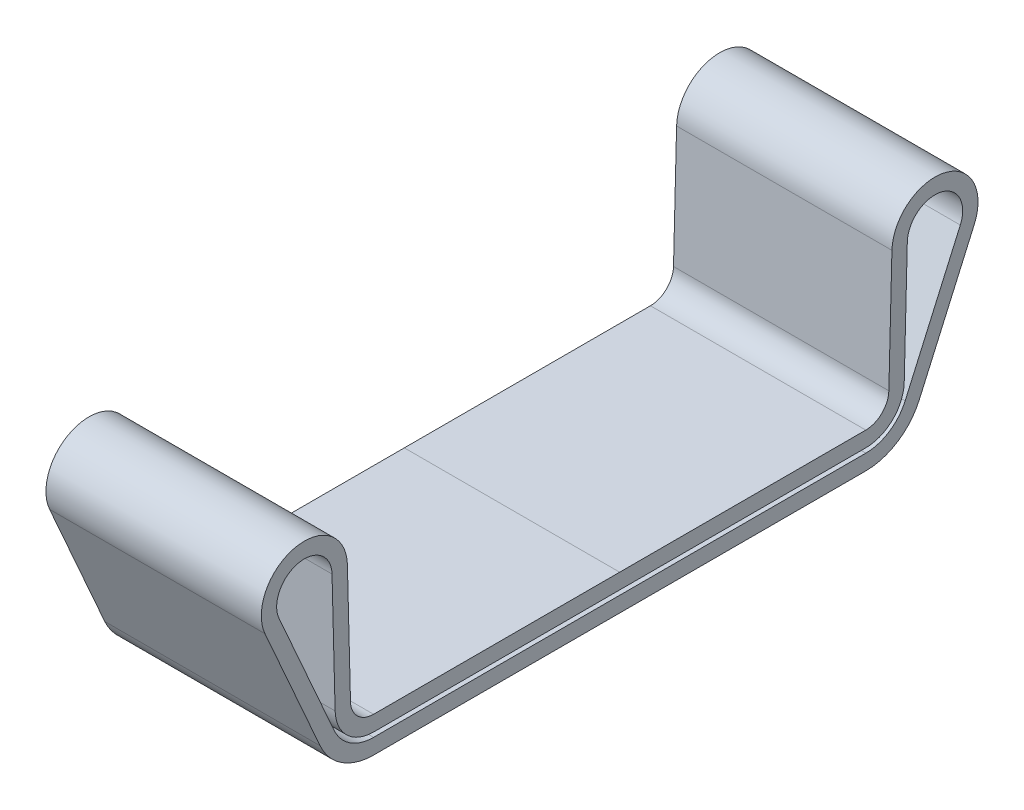
ISO-10303-21;
HEADER;
FILE_DESCRIPTION(('STEP AP214'),'2;1');
FILE_NAME('part.step','',(''),(''),'','','');
FILE_SCHEMA(('AUTOMOTIVE_DESIGN { 1 0 10303 214 1 1 1 1 }'));
ENDSEC;
DATA;
#1=APPLICATION_CONTEXT('core data for automotive mechanical design processes');
#2=APPLICATION_PROTOCOL_DEFINITION('international standard','automotive_design',2000,#1);
#3=PRODUCT_CONTEXT('',#1,'mechanical');
#4=PRODUCT('Part','Part','',(#3));
#5=PRODUCT_RELATED_PRODUCT_CATEGORY('part','',(#4));
#6=PRODUCT_DEFINITION_FORMATION('','',#4);
#7=PRODUCT_DEFINITION_CONTEXT('part definition',#1,'design');
#8=PRODUCT_DEFINITION('design','',#6,#7);
#9=PRODUCT_DEFINITION_SHAPE('','',#8);
#10=(LENGTH_UNIT() NAMED_UNIT(*) SI_UNIT(.MILLI.,.METRE.));
#11=(NAMED_UNIT(*) PLANE_ANGLE_UNIT() SI_UNIT($,.RADIAN.));
#12=(NAMED_UNIT(*) SI_UNIT($,.STERADIAN.) SOLID_ANGLE_UNIT());
#13=UNCERTAINTY_MEASURE_WITH_UNIT(LENGTH_MEASURE(1.E-05),#10,'distance_accuracy_value','');
#14=(GEOMETRIC_REPRESENTATION_CONTEXT(3) GLOBAL_UNCERTAINTY_ASSIGNED_CONTEXT((#13)) GLOBAL_UNIT_ASSIGNED_CONTEXT((#10,
#11,#12)) REPRESENTATION_CONTEXT('',''));
#15=CARTESIAN_POINT('',(0.,0.,0.));
#16=DIRECTION('',(0.,0.,1.));
#17=DIRECTION('',(1.,0.,0.));
#18=AXIS2_PLACEMENT_3D('',#15,#16,#17);
#19=CARTESIAN_POINT('',(7.,7.50000000000001,20.5));
#20=DIRECTION('',(-1.,0.,0.));
#21=DIRECTION('',(0.,0.,1.));
#22=AXIS2_PLACEMENT_3D('',#19,#20,#21);
#23=CYLINDRICAL_SURFACE('',#22,1.8);
#24=CARTESIAN_POINT('',(-7.,7.50000000000001,20.5));
#25=DIRECTION('',(-1.,0.,0.));
#26=DIRECTION('',(0.,0.,-1.));
#27=AXIS2_PLACEMENT_3D('',#24,#25,#26);
#28=CIRCLE('',#27,1.8);
#29=CARTESIAN_POINT('',(-7.,6.7718398936245,22.1461418102591));
#30=VERTEX_POINT('',#29);
#31=CARTESIAN_POINT('',(-7.,7.54628935623504,18.7005952941322));
#32=VERTEX_POINT('',#31);
#33=EDGE_CURVE('E189',#30,#32,#28,.T.);
#34=ORIENTED_EDGE('',*,*,#33,.T.);
#35=DIRECTION('',(-1.,0.,0.));
#36=VECTOR('',#35,1.);
#37=CARTESIAN_POINT('',(7.,7.54628935623504,18.7005952941322));
#38=LINE('',#37,#36);
#39=CARTESIAN_POINT('',(7.,7.54628935623504,18.7005952941322));
#40=VERTEX_POINT('',#39);
#41=EDGE_CURVE('E13',#40,#32,#38,.T.);
#42=ORIENTED_EDGE('',*,*,#41,.F.);
#43=CARTESIAN_POINT('',(7.,7.50000000000001,20.5));
#44=DIRECTION('',(-1.,0.,0.));
#45=DIRECTION('',(0.,0.,-1.));
#46=AXIS2_PLACEMENT_3D('',#43,#44,#45);
#47=CIRCLE('',#46,1.8);
#48=CARTESIAN_POINT('',(7.,6.7718398936245,22.1461418102591));
#49=VERTEX_POINT('',#48);
#50=EDGE_CURVE('E217',#49,#40,#47,.T.);
#51=ORIENTED_EDGE('',*,*,#50,.F.);
#52=DIRECTION('',(-1.,0.,0.));
#53=VECTOR('',#52,1.);
#54=CARTESIAN_POINT('',(7.,6.7718398936245,22.1461418102591));
#55=LINE('',#54,#53);
#56=EDGE_CURVE('E185',#49,#30,#55,.T.);
#57=ORIENTED_EDGE('',*,*,#56,.T.);
#58=EDGE_LOOP('',(#34,#42,#51,#57));
#59=FACE_BOUND('',#58,.T.);
#60=ADVANCED_FACE('F48',(#59),#23,.F.);
#61=CARTESIAN_POINT('',(7.,7.54628935623504,18.7005952941322));
#62=DIRECTION('',(0.,0.025716309019469,-0.999669281037692));
#63=DIRECTION('',(0.,0.999669281037692,0.025716309019469));
#64=AXIS2_PLACEMENT_3D('',#61,#62,#63);
#65=PLANE('',#64);
#66=DIRECTION('',(0.,-0.999669281037692,-0.0257163090194691));
#67=VECTOR('',#66,1.);
#68=CARTESIAN_POINT('',(-7.,7.54628935623504,18.7005952941322));
#69=LINE('',#68,#67);
#70=CARTESIAN_POINT('',(-7.,-0.26430130433916,18.4996692810377));
#71=VERTEX_POINT('',#70);
#72=EDGE_CURVE('E192',#32,#71,#69,.T.);
#73=ORIENTED_EDGE('',*,*,#72,.T.);
#74=DIRECTION('',(-1.,0.,0.));
#75=VECTOR('',#74,1.);
#76=CARTESIAN_POINT('',(7.,-0.26430130433916,18.4996692810377));
#77=LINE('',#76,#75);
#78=CARTESIAN_POINT('',(7.,-0.26430130433916,18.4996692810377));
#79=VERTEX_POINT('',#78);
#80=EDGE_CURVE('E56',#79,#71,#77,.T.);
#81=ORIENTED_EDGE('',*,*,#80,.F.);
#82=DIRECTION('',(0.,-0.999669281037692,-0.0257163090194691));
#83=VECTOR('',#82,1.);
#84=CARTESIAN_POINT('',(7.,7.54628935623504,18.7005952941322));
#85=LINE('',#84,#83);
#86=EDGE_CURVE('E123',#40,#79,#85,.T.);
#87=ORIENTED_EDGE('',*,*,#86,.F.);
#88=ORIENTED_EDGE('',*,*,#41,.T.);
#89=EDGE_LOOP('',(#73,#81,#87,#88));
#90=FACE_BOUND('',#89,.T.);
#91=ADVANCED_FACE('F500',(#90),#65,.F.);
#92=CARTESIAN_POINT('',(7.,-0.200010531790487,16.0004960784435));
#93=DIRECTION('',(-1.,0.,0.));
#94=DIRECTION('',(0.,0.,1.));
#95=AXIS2_PLACEMENT_3D('',#92,#93,#94);
#96=CYLINDRICAL_SURFACE('',#95,2.5);
#97=CARTESIAN_POINT('',(-7.,-0.200010531790487,16.0004960784435));
#98=DIRECTION('',(1.,0.,0.));
#99=DIRECTION('',(0.,0.,-1.));
#100=AXIS2_PLACEMENT_3D('',#97,#98,#99);
#101=CIRCLE('',#100,2.5);
#102=CARTESIAN_POINT('',(-7.,-2.70001053178995,16.0004944329022));
#103=VERTEX_POINT('',#102);
#104=EDGE_CURVE('E195',#71,#103,#101,.T.);
#105=ORIENTED_EDGE('',*,*,#104,.T.);
#106=DIRECTION('',(-1.,0.,0.));
#107=VECTOR('',#106,1.);
#108=CARTESIAN_POINT('',(7.,-2.70001053178995,16.0004944329022));
#109=LINE('',#108,#107);
#110=CARTESIAN_POINT('',(7.,-2.70001053178995,16.0004944329022));
#111=VERTEX_POINT('',#110);
#112=EDGE_CURVE('E246',#111,#103,#109,.T.);
#113=ORIENTED_EDGE('',*,*,#112,.F.);
#114=CARTESIAN_POINT('',(7.,-0.200010531790487,16.0004960784435));
#115=DIRECTION('',(1.,0.,0.));
#116=DIRECTION('',(0.,0.,-1.));
#117=AXIS2_PLACEMENT_3D('',#114,#115,#116);
#118=CIRCLE('',#117,2.5);
#119=EDGE_CURVE('E256',#79,#111,#118,.T.);
#120=ORIENTED_EDGE('',*,*,#119,.F.);
#121=ORIENTED_EDGE('',*,*,#80,.T.);
#122=EDGE_LOOP('',(#105,#113,#120,#121));
#123=FACE_BOUND('',#122,.T.);
#124=ADVANCED_FACE('F254',(#123),#96,.T.);
#125=CARTESIAN_POINT('',(7.,-2.70000000000084,0.));
#126=DIRECTION('',(0.,0.999999999999784,6.58216478839203E-07));
#127=DIRECTION('',(0.,-6.58216478839203E-07,0.999999999999784));
#128=AXIS2_PLACEMENT_3D('',#125,#126,#127);
#129=PLANE('',#128);
#130=DIRECTION('',(0.,6.58216478839203E-07,-0.999999999999783));
#131=VECTOR('',#130,1.);
#132=CARTESIAN_POINT('',(-7.,-2.70000000000084,0.));
#133=LINE('',#132,#131);
#134=CARTESIAN_POINT('',(-7.,-2.70000000000084,0.));
#135=VERTEX_POINT('',#134);
#136=EDGE_CURVE('E197',#103,#135,#133,.T.);
#137=ORIENTED_EDGE('',*,*,#136,.T.);
#138=DIRECTION('',(-1.,0.,0.));
#139=VECTOR('',#138,1.);
#140=CARTESIAN_POINT('',(7.,-2.70000000000084,0.));
#141=LINE('',#140,#139);
#142=CARTESIAN_POINT('',(7.,-2.70000000000084,0.));
#143=VERTEX_POINT('',#142);
#144=EDGE_CURVE('E243',#143,#135,#141,.T.);
#145=ORIENTED_EDGE('',*,*,#144,.F.);
#146=DIRECTION('',(0.,6.58216478839203E-07,-0.999999999999783));
#147=VECTOR('',#146,1.);
#148=CARTESIAN_POINT('',(7.,-2.70000000000084,0.));
#149=LINE('',#148,#147);
#150=EDGE_CURVE('E363',#111,#143,#149,.T.);
#151=ORIENTED_EDGE('',*,*,#150,.F.);
#152=ORIENTED_EDGE('',*,*,#112,.T.);
#153=EDGE_LOOP('',(#137,#145,#151,#152));
#154=FACE_BOUND('',#153,.T.);
#155=ADVANCED_FACE('F268',(#154),#129,.F.);
#156=CARTESIAN_POINT('',(7.,-1.70000000000085,0.));
#157=DIRECTION('',(0.,-0.999999999999784,-6.5821646306444E-07));
#158=DIRECTION('',(0.,6.5821646306444E-07,-0.999999999999784));
#159=AXIS2_PLACEMENT_3D('',#156,#157,#158);
#160=PLANE('',#159);
#161=DIRECTION('',(0.,-6.5821646306444E-07,0.999999999999783));
#162=VECTOR('',#161,1.);
#163=CARTESIAN_POINT('',(-7.,-1.70000000000085,0.));
#164=LINE('',#163,#162);
#165=CARTESIAN_POINT('',(-7.,-1.70000000000085,0.));
#166=VERTEX_POINT('',#165);
#167=CARTESIAN_POINT('',(-7.,-1.70001053179016,16.0004950911187));
#168=VERTEX_POINT('',#167);
#169=EDGE_CURVE('E199',#166,#168,#164,.T.);
#170=ORIENTED_EDGE('',*,*,#169,.T.);
#171=DIRECTION('',(-1.,0.,0.));
#172=VECTOR('',#171,1.);
#173=CARTESIAN_POINT('',(7.,-1.70001053179016,16.0004950911187));
#174=LINE('',#173,#172);
#175=CARTESIAN_POINT('',(7.,-1.70001053179016,16.0004950911187));
#176=VERTEX_POINT('',#175);
#177=EDGE_CURVE('E237',#176,#168,#174,.T.);
#178=ORIENTED_EDGE('',*,*,#177,.F.);
#179=DIRECTION('',(0.,-6.5821646306444E-07,0.999999999999783));
#180=VECTOR('',#179,1.);
#181=CARTESIAN_POINT('',(7.,-1.70000000000085,0.));
#182=LINE('',#181,#180);
#183=CARTESIAN_POINT('',(7.,-1.70000000000085,0.));
#184=VERTEX_POINT('',#183);
#185=EDGE_CURVE('E365',#184,#176,#182,.T.);
#186=ORIENTED_EDGE('',*,*,#185,.F.);
#187=DIRECTION('',(-1.,0.,0.));
#188=VECTOR('',#187,1.);
#189=CARTESIAN_POINT('',(7.,-1.70000000000085,0.));
#190=LINE('',#189,#188);
#191=EDGE_CURVE('E240',#184,#166,#190,.T.);
#192=ORIENTED_EDGE('',*,*,#191,.T.);
#193=EDGE_LOOP('',(#170,#178,#186,#192));
#194=FACE_BOUND('',#193,.T.);
#195=ADVANCED_FACE('F433',(#194),#160,.F.);
#196=CARTESIAN_POINT('',(7.,-0.200010531790487,16.0004960784435));
#197=DIRECTION('',(-1.,0.,0.));
#198=DIRECTION('',(0.,0.,1.));
#199=AXIS2_PLACEMENT_3D('',#196,#197,#198);
#200=CYLINDRICAL_SURFACE('',#199,1.49999999999999);
#201=CARTESIAN_POINT('',(-7.,-0.200010531790487,16.0004960784435));
#202=DIRECTION('',(-1.,0.,0.));
#203=DIRECTION('',(0.,0.,-1.));
#204=AXIS2_PLACEMENT_3D('',#201,#202,#203);
#205=CIRCLE('',#204,1.49999999999999);
#206=CARTESIAN_POINT('',(-7.,-0.238584995319702,17.5));
#207=VERTEX_POINT('',#206);
#208=EDGE_CURVE('E201',#168,#207,#205,.T.);
#209=ORIENTED_EDGE('',*,*,#208,.T.);
#210=DIRECTION('',(-1.,0.,0.));
#211=VECTOR('',#210,1.);
#212=CARTESIAN_POINT('',(7.,-0.238584995319702,17.5));
#213=LINE('',#212,#211);
#214=CARTESIAN_POINT('',(7.,-0.238584995319702,17.5));
#215=VERTEX_POINT('',#214);
#216=EDGE_CURVE('E233',#215,#207,#213,.T.);
#217=ORIENTED_EDGE('',*,*,#216,.F.);
#218=CARTESIAN_POINT('',(7.,-0.200010531790487,16.0004960784435));
#219=DIRECTION('',(-1.,0.,0.));
#220=DIRECTION('',(0.,0.,-1.));
#221=AXIS2_PLACEMENT_3D('',#218,#219,#220);
#222=CIRCLE('',#221,1.49999999999999);
#223=EDGE_CURVE('E367',#176,#215,#222,.T.);
#224=ORIENTED_EDGE('',*,*,#223,.F.);
#225=ORIENTED_EDGE('',*,*,#177,.T.);
#226=EDGE_LOOP('',(#209,#217,#224,#225));
#227=FACE_BOUND('',#226,.T.);
#228=ADVANCED_FACE('F665',(#227),#200,.F.);
#229=CARTESIAN_POINT('',(7.,7.57200566525451,17.7009260130945));
#230=DIRECTION('',(0.,-0.0257163090194695,0.999669281037691));
#231=DIRECTION('',(0.,-0.999669281037692,-0.0257163090194695));
#232=AXIS2_PLACEMENT_3D('',#229,#230,#231);
#233=PLANE('',#232);
#234=DIRECTION('',(0.,0.999669281037692,0.0257163090194695));
#235=VECTOR('',#234,1.);
#236=CARTESIAN_POINT('',(-7.,7.57200566525451,17.7009260130945));
#237=LINE('',#236,#235);
#238=CARTESIAN_POINT('',(-7.,7.57200566525451,17.7009260130945));
#239=VERTEX_POINT('',#238);
#240=EDGE_CURVE('E203',#207,#239,#237,.T.);
#241=ORIENTED_EDGE('',*,*,#240,.T.);
#242=DIRECTION('',(-1.,0.,0.));
#243=VECTOR('',#242,1.);
#244=CARTESIAN_POINT('',(7.,7.57200566525451,17.7009260130945));
#245=LINE('',#244,#243);
#246=CARTESIAN_POINT('',(7.,7.57200566525451,17.7009260130945));
#247=VERTEX_POINT('',#246);
#248=EDGE_CURVE('E230',#247,#239,#245,.T.);
#249=ORIENTED_EDGE('',*,*,#248,.F.);
#250=DIRECTION('',(0.,0.999669281037692,0.0257163090194695));
#251=VECTOR('',#250,1.);
#252=CARTESIAN_POINT('',(7.,7.57200566525451,17.7009260130945));
#253=LINE('',#252,#251);
#254=EDGE_CURVE('E369',#215,#247,#253,.T.);
#255=ORIENTED_EDGE('',*,*,#254,.F.);
#256=ORIENTED_EDGE('',*,*,#216,.T.);
#257=EDGE_LOOP('',(#241,#249,#255,#256));
#258=FACE_BOUND('',#257,.T.);
#259=ADVANCED_FACE('F657',(#258),#233,.F.);
#260=CARTESIAN_POINT('',(7.,7.50000000000001,20.5));
#261=DIRECTION('',(-1.,0.,0.));
#262=DIRECTION('',(0.,0.,1.));
#263=AXIS2_PLACEMENT_3D('',#260,#261,#262);
#264=CYLINDRICAL_SURFACE('',#263,2.80000000000001);
#265=CARTESIAN_POINT('',(-7.,7.50000000000001,20.5));
#266=DIRECTION('',(1.,0.,0.));
#267=DIRECTION('',(0.,0.,-1.));
#268=AXIS2_PLACEMENT_3D('',#265,#266,#267);
#269=CIRCLE('',#268,2.80000000000001);
#270=CARTESIAN_POINT('',(-7.,6.36730650119366,23.0606650381809));
#271=VERTEX_POINT('',#270);
#272=EDGE_CURVE('E205',#239,#271,#269,.T.);
#273=ORIENTED_EDGE('',*,*,#272,.T.);
#274=DIRECTION('',(-1.,0.,0.));
#275=VECTOR('',#274,1.);
#276=CARTESIAN_POINT('',(7.,6.36730650119366,23.0606650381809));
#277=LINE('',#276,#275);
#278=CARTESIAN_POINT('',(7.,6.36730650119366,23.0606650381809));
#279=VERTEX_POINT('',#278);
#280=EDGE_CURVE('E227',#279,#271,#277,.T.);
#281=ORIENTED_EDGE('',*,*,#280,.F.);
#282=CARTESIAN_POINT('',(7.,7.50000000000001,20.5));
#283=DIRECTION('',(1.,0.,0.));
#284=DIRECTION('',(0.,0.,-1.));
#285=AXIS2_PLACEMENT_3D('',#282,#283,#284);
#286=CIRCLE('',#285,2.80000000000001);
#287=EDGE_CURVE('E371',#247,#279,#286,.T.);
#288=ORIENTED_EDGE('',*,*,#287,.F.);
#289=ORIENTED_EDGE('',*,*,#248,.T.);
#290=EDGE_LOOP('',(#273,#281,#288,#289));
#291=FACE_BOUND('',#290,.T.);
#292=ADVANCED_FACE('F649',(#291),#264,.T.);
#293=CARTESIAN_POINT('',(7.,-1.73723316256695,19.4756747129795));
#294=DIRECTION('',(0.,0.404533392430836,-0.91452322792174));
#295=DIRECTION('',(0.,0.914523227921741,0.404533392430836));
#296=AXIS2_PLACEMENT_3D('',#293,#294,#295);
#297=PLANE('',#296);
#298=DIRECTION('',(0.,-0.91452322792174,-0.404533392430836));
#299=VECTOR('',#298,1.);
#300=CARTESIAN_POINT('',(-7.,-1.73723316256695,19.4756747129795));
#301=LINE('',#300,#299);
#302=CARTESIAN_POINT('',(-7.,-1.73723316256695,19.4756747129795));
#303=VERTEX_POINT('',#302);
#304=EDGE_CURVE('E207',#271,#303,#301,.T.);
#305=ORIENTED_EDGE('',*,*,#304,.T.);
#306=DIRECTION('',(-1.,0.,0.));
#307=VECTOR('',#306,1.);
#308=CARTESIAN_POINT('',(7.,-1.73723316256695,19.4756747129795));
#309=LINE('',#308,#307);
#310=CARTESIAN_POINT('',(7.,-1.73723316256695,19.4756747129795));
#311=VERTEX_POINT('',#310);
#312=EDGE_CURVE('E223',#311,#303,#309,.T.);
#313=ORIENTED_EDGE('',*,*,#312,.F.);
#314=DIRECTION('',(0.,-0.91452322792174,-0.404533392430836));
#315=VECTOR('',#314,1.);
#316=CARTESIAN_POINT('',(7.,-1.73723316256695,19.4756747129795));
#317=LINE('',#316,#315);
#318=EDGE_CURVE('E373',#279,#311,#317,.T.);
#319=ORIENTED_EDGE('',*,*,#318,.F.);
#320=ORIENTED_EDGE('',*,*,#280,.T.);
#321=EDGE_LOOP('',(#305,#313,#319,#320));
#322=FACE_BOUND('',#321,.T.);
#323=ADVANCED_FACE('F641',(#322),#297,.F.);
#324=CARTESIAN_POINT('',(7.,-0.200010531790487,16.0004960784435));
#325=DIRECTION('',(-1.,0.,0.));
#326=DIRECTION('',(0.,0.,1.));
#327=AXIS2_PLACEMENT_3D('',#324,#325,#326);
#328=CYLINDRICAL_SURFACE('',#327,3.79998946821005);
#329=CARTESIAN_POINT('',(-7.,-0.200010531790487,16.0004960784435));
#330=DIRECTION('',(1.,0.,0.));
#331=DIRECTION('',(0.,0.,1.));
#332=AXIS2_PLACEMENT_3D('',#329,#330,#331);
#333=CIRCLE('',#332,3.79998946821005);
#334=CARTESIAN_POINT('',(-7.,-4.00000000000053,16.0004960784435));
#335=VERTEX_POINT('',#334);
#336=EDGE_CURVE('E209',#303,#335,#333,.T.);
#337=ORIENTED_EDGE('',*,*,#336,.T.);
#338=DIRECTION('',(-1.,0.,0.));
#339=VECTOR('',#338,1.);
#340=CARTESIAN_POINT('',(7.,-4.00000000000053,16.0004960784435));
#341=LINE('',#340,#339);
#342=CARTESIAN_POINT('',(7.,-4.00000000000053,16.0004960784435));
#343=VERTEX_POINT('',#342);
#344=EDGE_CURVE('E177',#343,#335,#341,.T.);
#345=ORIENTED_EDGE('',*,*,#344,.F.);
#346=CARTESIAN_POINT('',(7.,-0.200010531790487,16.0004960784435));
#347=DIRECTION('',(1.,0.,0.));
#348=DIRECTION('',(0.,0.,1.));
#349=AXIS2_PLACEMENT_3D('',#346,#347,#348);
#350=CIRCLE('',#349,3.79998946821005);
#351=EDGE_CURVE('E375',#311,#343,#350,.T.);
#352=ORIENTED_EDGE('',*,*,#351,.F.);
#353=ORIENTED_EDGE('',*,*,#312,.T.);
#354=EDGE_LOOP('',(#337,#345,#352,#353));
#355=FACE_BOUND('',#354,.T.);
#356=ADVANCED_FACE('F633',(#355),#328,.T.);
#357=CARTESIAN_POINT('',(7.,-4.00000000000084,0.));
#358=DIRECTION('',(0.,1.,0.));
#359=DIRECTION('',(0.,0.,1.));
#360=AXIS2_PLACEMENT_3D('',#357,#358,#359);
#361=PLANE('',#360);
#362=DIRECTION('',(0.,0.,-1.));
#363=VECTOR('',#362,1.);
#364=CARTESIAN_POINT('',(-7.,-4.00000000000084,0.));
#365=LINE('',#364,#363);
#366=CARTESIAN_POINT('',(-7.,-4.00000000000053,-16.0004960784435));
#367=VERTEX_POINT('',#366);
#368=EDGE_CURVE('E211',#335,#367,#365,.T.);
#369=ORIENTED_EDGE('',*,*,#368,.T.);
#370=DIRECTION('',(-1.,0.,0.));
#371=VECTOR('',#370,1.);
#372=CARTESIAN_POINT('',(7.,-4.00000000000053,-16.0004960784435));
#373=LINE('',#372,#371);
#374=CARTESIAN_POINT('',(7.,-4.00000000000053,-16.0004960784435));
#375=VERTEX_POINT('',#374);
#376=EDGE_CURVE('E350',#375,#367,#373,.T.);
#377=ORIENTED_EDGE('',*,*,#376,.F.);
#378=DIRECTION('',(0.,0.,-1.));
#379=VECTOR('',#378,1.);
#380=CARTESIAN_POINT('',(7.,-4.00000000000084,0.));
#381=LINE('',#380,#379);
#382=EDGE_CURVE('E171',#343,#375,#381,.T.);
#383=ORIENTED_EDGE('',*,*,#382,.F.);
#384=ORIENTED_EDGE('',*,*,#344,.T.);
#385=EDGE_LOOP('',(#369,#377,#383,#384));
#386=FACE_BOUND('',#385,.T.);
#387=ADVANCED_FACE('F390',(#386),#361,.F.);
#388=CARTESIAN_POINT('',(7.,-3.00000000000085,0.));
#389=DIRECTION('',(0.,-1.,0.));
#390=DIRECTION('',(0.,0.,-1.));
#391=AXIS2_PLACEMENT_3D('',#388,#389,#390);
#392=PLANE('',#391);
#393=DIRECTION('',(0.,0.,1.));
#394=VECTOR('',#393,1.);
#395=CARTESIAN_POINT('',(-7.,-3.00000000000085,0.));
#396=LINE('',#395,#394);
#397=CARTESIAN_POINT('',(-7.,-3.00000000000053,-16.0004960784435));
#398=VERTEX_POINT('',#397);
#399=CARTESIAN_POINT('',(-7.,-3.00000000000053,16.0004960784435));
#400=VERTEX_POINT('',#399);
#401=EDGE_CURVE('E176',#398,#400,#396,.T.);
#402=ORIENTED_EDGE('',*,*,#401,.T.);
#403=DIRECTION('',(-1.,0.,0.));
#404=VECTOR('',#403,1.);
#405=CARTESIAN_POINT('',(7.,-3.00000000000053,16.0004960784435));
#406=LINE('',#405,#404);
#407=CARTESIAN_POINT('',(7.,-3.00000000000053,16.0004960784435));
#408=VERTEX_POINT('',#407);
#409=EDGE_CURVE('E173',#408,#400,#406,.T.);
#410=ORIENTED_EDGE('',*,*,#409,.F.);
#411=DIRECTION('',(0.,0.,1.));
#412=VECTOR('',#411,1.);
#413=CARTESIAN_POINT('',(7.,-3.00000000000085,0.));
#414=LINE('',#413,#412);
#415=CARTESIAN_POINT('',(7.,-3.00000000000053,-16.0004960784435));
#416=VERTEX_POINT('',#415);
#417=EDGE_CURVE('E158',#416,#408,#414,.T.);
#418=ORIENTED_EDGE('',*,*,#417,.F.);
#419=DIRECTION('',(-1.,0.,0.));
#420=VECTOR('',#419,1.);
#421=CARTESIAN_POINT('',(7.,-3.00000000000053,-16.0004960784435));
#422=LINE('',#421,#420);
#423=EDGE_CURVE('E353',#416,#398,#422,.T.);
#424=ORIENTED_EDGE('',*,*,#423,.T.);
#425=EDGE_LOOP('',(#402,#410,#418,#424));
#426=FACE_BOUND('',#425,.T.);
#427=ADVANCED_FACE('F174',(#426),#392,.F.);
#428=CARTESIAN_POINT('',(7.,-0.200010531790487,16.0004960784435));
#429=DIRECTION('',(-1.,0.,0.));
#430=DIRECTION('',(0.,0.,1.));
#431=AXIS2_PLACEMENT_3D('',#428,#429,#430);
#432=CYLINDRICAL_SURFACE('',#431,2.79998946821004);
#433=CARTESIAN_POINT('',(-7.,-0.200010531790487,16.0004960784435));
#434=DIRECTION('',(-1.,0.,0.));
#435=DIRECTION('',(0.,0.,-1.));
#436=AXIS2_PLACEMENT_3D('',#433,#434,#435);
#437=CIRCLE('',#436,2.79998946821004);
#438=CARTESIAN_POINT('',(-7.,-1.33269977013611,18.5611514850578));
#439=VERTEX_POINT('',#438);
#440=EDGE_CURVE('E109',#400,#439,#437,.T.);
#441=ORIENTED_EDGE('',*,*,#440,.T.);
#442=DIRECTION('',(-1.,0.,0.));
#443=VECTOR('',#442,1.);
#444=CARTESIAN_POINT('',(7.,-1.33269977013611,18.5611514850578));
#445=LINE('',#444,#443);
#446=CARTESIAN_POINT('',(7.,-1.33269977013611,18.5611514850578));
#447=VERTEX_POINT('',#446);
#448=EDGE_CURVE('E178',#447,#439,#445,.T.);
#449=ORIENTED_EDGE('',*,*,#448,.F.);
#450=CARTESIAN_POINT('',(7.,-0.200010531790487,16.0004960784435));
#451=DIRECTION('',(-1.,0.,0.));
#452=DIRECTION('',(0.,0.,-1.));
#453=AXIS2_PLACEMENT_3D('',#450,#451,#452);
#454=CIRCLE('',#453,2.79998946821004);
#455=EDGE_CURVE('E163',#408,#447,#454,.T.);
#456=ORIENTED_EDGE('',*,*,#455,.F.);
#457=ORIENTED_EDGE('',*,*,#409,.T.);
#458=EDGE_LOOP('',(#441,#449,#456,#457));
#459=FACE_BOUND('',#458,.T.);
#460=ADVANCED_FACE('F180',(#459),#432,.F.);
#461=CARTESIAN_POINT('',(7.,6.7718398936245,22.1461418102591));
#462=DIRECTION('',(0.,-0.404533392430836,0.91452322792174));
#463=DIRECTION('',(0.,-0.91452322792174,-0.404533392430836));
#464=AXIS2_PLACEMENT_3D('',#461,#462,#463);
#465=PLANE('',#464);
#466=DIRECTION('',(0.,0.91452322792174,0.404533392430836));
#467=VECTOR('',#466,1.);
#468=CARTESIAN_POINT('',(-7.,6.7718398936245,22.1461418102591));
#469=LINE('',#468,#467);
#470=EDGE_CURVE('E115',#439,#30,#469,.T.);
#471=ORIENTED_EDGE('',*,*,#470,.T.);
#472=ORIENTED_EDGE('',*,*,#56,.F.);
#473=DIRECTION('',(0.,0.91452322792174,0.404533392430836));
#474=VECTOR('',#473,1.);
#475=CARTESIAN_POINT('',(7.,6.7718398936245,22.1461418102591));
#476=LINE('',#475,#474);
#477=EDGE_CURVE('E64',#447,#49,#476,.T.);
#478=ORIENTED_EDGE('',*,*,#477,.F.);
#479=ORIENTED_EDGE('',*,*,#448,.T.);
#480=EDGE_LOOP('',(#471,#472,#478,#479));
#481=FACE_BOUND('',#480,.T.);
#482=ADVANCED_FACE('F496',(#481),#465,.F.);
#483=CARTESIAN_POINT('',(7.,7.50000000000001,20.5));
#484=DIRECTION('',(1.,0.,0.));
#485=DIRECTION('',(0.,0.,-1.));
#486=AXIS2_PLACEMENT_3D('',#483,#484,#485);
#487=PLANE('',#486);
#488=CARTESIAN_POINT('',(7.,-0.200010531790487,-16.0004960784435));
#489=DIRECTION('',(1.,0.,0.));
#490=DIRECTION('',(0.,0.,1.));
#491=AXIS2_PLACEMENT_3D('',#488,#489,#490);
#492=CIRCLE('',#491,2.79998946821004);
#493=CARTESIAN_POINT('',(7.,-1.33269977013611,-18.5611514850578));
#494=VERTEX_POINT('',#493);
#495=EDGE_CURVE('E167',#416,#494,#492,.T.);
#496=ORIENTED_EDGE('',*,*,#495,.F.);
#497=ORIENTED_EDGE('',*,*,#417,.T.);
#498=ORIENTED_EDGE('',*,*,#455,.T.);
#499=ORIENTED_EDGE('',*,*,#477,.T.);
#500=ORIENTED_EDGE('',*,*,#50,.T.);
#501=ORIENTED_EDGE('',*,*,#86,.T.);
#502=ORIENTED_EDGE('',*,*,#119,.T.);
#503=ORIENTED_EDGE('',*,*,#150,.T.);
#504=DIRECTION('',(0.,6.58216478839203E-07,0.999999999999783));
#505=VECTOR('',#504,1.);
#506=CARTESIAN_POINT('',(7.,-2.70000000000084,0.));
#507=LINE('',#506,#505);
#508=CARTESIAN_POINT('',(7.,-2.70001053178995,-16.0004944329022));
#509=VERTEX_POINT('',#508);
#510=EDGE_CURVE('E276',#509,#143,#507,.T.);
#511=ORIENTED_EDGE('',*,*,#510,.F.);
#512=CARTESIAN_POINT('',(7.,-0.200010531790487,-16.0004960784435));
#513=DIRECTION('',(-1.,0.,0.));
#514=DIRECTION('',(0.,0.,1.));
#515=AXIS2_PLACEMENT_3D('',#512,#513,#514);
#516=CIRCLE('',#515,2.5);
#517=CARTESIAN_POINT('',(7.,-0.26430130433916,-18.4996692810377));
#518=VERTEX_POINT('',#517);
#519=EDGE_CURVE('E282',#518,#509,#516,.T.);
#520=ORIENTED_EDGE('',*,*,#519,.F.);
#521=DIRECTION('',(0.,-0.999669281037692,0.0257163090194691));
#522=VECTOR('',#521,1.);
#523=CARTESIAN_POINT('',(7.,7.54628935623504,-18.7005952941322));
#524=LINE('',#523,#522);
#525=CARTESIAN_POINT('',(7.,7.54628935623504,-18.7005952941322));
#526=VERTEX_POINT('',#525);
#527=EDGE_CURVE('E285',#526,#518,#524,.T.);
#528=ORIENTED_EDGE('',*,*,#527,.F.);
#529=CARTESIAN_POINT('',(7.,7.50000000000001,-20.5));
#530=DIRECTION('',(1.,0.,0.));
#531=DIRECTION('',(0.,0.,1.));
#532=AXIS2_PLACEMENT_3D('',#529,#530,#531);
#533=CIRCLE('',#532,1.8);
#534=CARTESIAN_POINT('',(7.,6.7718398936245,-22.1461418102591));
#535=VERTEX_POINT('',#534);
#536=EDGE_CURVE('E328',#535,#526,#533,.T.);
#537=ORIENTED_EDGE('',*,*,#536,.F.);
#538=DIRECTION('',(0.,0.91452322792174,-0.404533392430836));
#539=VECTOR('',#538,1.);
#540=CARTESIAN_POINT('',(7.,6.7718398936245,-22.1461418102591));
#541=LINE('',#540,#539);
#542=EDGE_CURVE('E401',#494,#535,#541,.T.);
#543=ORIENTED_EDGE('',*,*,#542,.F.);
#544=EDGE_LOOP('',(#496,#497,#498,#499,#500,#501,#502,#503,#511,#520,#528,#537,#543));
#545=FACE_BOUND('',#544,.T.);
#546=ORIENTED_EDGE('',*,*,#382,.T.);
#547=CARTESIAN_POINT('',(7.,-0.200010531790487,-16.0004960784435));
#548=DIRECTION('',(-1.,0.,0.));
#549=DIRECTION('',(0.,0.,-1.));
#550=AXIS2_PLACEMENT_3D('',#547,#548,#549);
#551=CIRCLE('',#550,3.79998946821005);
#552=CARTESIAN_POINT('',(7.,-1.73723316256695,-19.4756747129795));
#553=VERTEX_POINT('',#552);
#554=EDGE_CURVE('E384',#553,#375,#551,.T.);
#555=ORIENTED_EDGE('',*,*,#554,.F.);
#556=DIRECTION('',(0.,-0.91452322792174,0.404533392430836));
#557=VECTOR('',#556,1.);
#558=CARTESIAN_POINT('',(7.,-1.73723316256695,-19.4756747129795));
#559=LINE('',#558,#557);
#560=CARTESIAN_POINT('',(7.,6.36730650119366,-23.0606650381809));
#561=VERTEX_POINT('',#560);
#562=EDGE_CURVE('E397',#561,#553,#559,.T.);
#563=ORIENTED_EDGE('',*,*,#562,.F.);
#564=CARTESIAN_POINT('',(7.,7.50000000000001,-20.5));
#565=DIRECTION('',(-1.,0.,0.));
#566=DIRECTION('',(0.,0.,1.));
#567=AXIS2_PLACEMENT_3D('',#564,#565,#566);
#568=CIRCLE('',#567,2.80000000000001);
#569=CARTESIAN_POINT('',(7.,7.57200566525451,-17.7009260130945));
#570=VERTEX_POINT('',#569);
#571=EDGE_CURVE('E399',#570,#561,#568,.T.);
#572=ORIENTED_EDGE('',*,*,#571,.F.);
#573=DIRECTION('',(0.,0.999669281037692,-0.0257163090194695));
#574=VECTOR('',#573,1.);
#575=CARTESIAN_POINT('',(7.,7.57200566525451,-17.7009260130945));
#576=LINE('',#575,#574);
#577=CARTESIAN_POINT('',(7.,-0.238584995319702,-17.5));
#578=VERTEX_POINT('',#577);
#579=EDGE_CURVE('E407',#578,#570,#576,.T.);
#580=ORIENTED_EDGE('',*,*,#579,.F.);
#581=CARTESIAN_POINT('',(7.,-0.200010531790487,-16.0004960784435));
#582=DIRECTION('',(1.,0.,0.));
#583=DIRECTION('',(0.,0.,1.));
#584=AXIS2_PLACEMENT_3D('',#581,#582,#583);
#585=CIRCLE('',#584,1.49999999999999);
#586=CARTESIAN_POINT('',(7.,-1.70001053179016,-16.0004950911187));
#587=VERTEX_POINT('',#586);
#588=EDGE_CURVE('E288',#587,#578,#585,.T.);
#589=ORIENTED_EDGE('',*,*,#588,.F.);
#590=DIRECTION('',(0.,-6.5821646306444E-07,-0.999999999999783));
#591=VECTOR('',#590,1.);
#592=CARTESIAN_POINT('',(7.,-1.70000000000085,0.));
#593=LINE('',#592,#591);
#594=EDGE_CURVE('E283',#184,#587,#593,.T.);
#595=ORIENTED_EDGE('',*,*,#594,.F.);
#596=ORIENTED_EDGE('',*,*,#185,.T.);
#597=ORIENTED_EDGE('',*,*,#223,.T.);
#598=ORIENTED_EDGE('',*,*,#254,.T.);
#599=ORIENTED_EDGE('',*,*,#287,.T.);
#600=ORIENTED_EDGE('',*,*,#318,.T.);
#601=ORIENTED_EDGE('',*,*,#351,.T.);
#602=EDGE_LOOP('',(#546,#555,#563,#572,#580,#589,#595,#596,#597,#598,#599,#600,#601));
#603=FACE_BOUND('',#602,.T.);
#604=ADVANCED_FACE('F160',(#545,#603),#487,.T.);
#605=CARTESIAN_POINT('',(-7.,7.50000000000001,20.5));
#606=DIRECTION('',(1.,0.,0.));
#607=DIRECTION('',(0.,0.,-1.));
#608=AXIS2_PLACEMENT_3D('',#605,#606,#607);
#609=PLANE('',#608);
#610=ORIENTED_EDGE('',*,*,#401,.F.);
#611=CARTESIAN_POINT('',(-7.,-0.200010531790487,-16.0004960784435));
#612=DIRECTION('',(1.,0.,0.));
#613=DIRECTION('',(0.,0.,1.));
#614=AXIS2_PLACEMENT_3D('',#611,#612,#613);
#615=CIRCLE('',#614,2.79998946821004);
#616=CARTESIAN_POINT('',(-7.,-1.33269977013611,-18.5611514850578));
#617=VERTEX_POINT('',#616);
#618=EDGE_CURVE('E301',#398,#617,#615,.T.);
#619=ORIENTED_EDGE('',*,*,#618,.T.);
#620=DIRECTION('',(0.,0.91452322792174,-0.404533392430836));
#621=VECTOR('',#620,1.);
#622=CARTESIAN_POINT('',(-7.,6.7718398936245,-22.1461418102591));
#623=LINE('',#622,#621);
#624=CARTESIAN_POINT('',(-7.,6.7718398936245,-22.1461418102591));
#625=VERTEX_POINT('',#624);
#626=EDGE_CURVE('E298',#617,#625,#623,.T.);
#627=ORIENTED_EDGE('',*,*,#626,.T.);
#628=CARTESIAN_POINT('',(-7.,7.50000000000001,-20.5));
#629=DIRECTION('',(1.,0.,0.));
#630=DIRECTION('',(0.,0.,1.));
#631=AXIS2_PLACEMENT_3D('',#628,#629,#630);
#632=CIRCLE('',#631,1.8);
#633=CARTESIAN_POINT('',(-7.,7.54628935623504,-18.7005952941322));
#634=VERTEX_POINT('',#633);
#635=EDGE_CURVE('E295',#625,#634,#632,.T.);
#636=ORIENTED_EDGE('',*,*,#635,.T.);
#637=DIRECTION('',(0.,-0.999669281037692,0.0257163090194691));
#638=VECTOR('',#637,1.);
#639=CARTESIAN_POINT('',(-7.,7.54628935623504,-18.7005952941322));
#640=LINE('',#639,#638);
#641=CARTESIAN_POINT('',(-7.,-0.26430130433916,-18.4996692810377));
#642=VERTEX_POINT('',#641);
#643=EDGE_CURVE('E325',#634,#642,#640,.T.);
#644=ORIENTED_EDGE('',*,*,#643,.T.);
#645=CARTESIAN_POINT('',(-7.,-0.200010531790487,-16.0004960784435));
#646=DIRECTION('',(-1.,0.,0.));
#647=DIRECTION('',(0.,0.,1.));
#648=AXIS2_PLACEMENT_3D('',#645,#646,#647);
#649=CIRCLE('',#648,2.5);
#650=CARTESIAN_POINT('',(-7.,-2.70001053178995,-16.0004944329022));
#651=VERTEX_POINT('',#650);
#652=EDGE_CURVE('E323',#642,#651,#649,.T.);
#653=ORIENTED_EDGE('',*,*,#652,.T.);
#654=DIRECTION('',(0.,6.58216478839203E-07,0.999999999999783));
#655=VECTOR('',#654,1.);
#656=CARTESIAN_POINT('',(-7.,-2.70000000000084,0.));
#657=LINE('',#656,#655);
#658=EDGE_CURVE('E265',#651,#135,#657,.T.);
#659=ORIENTED_EDGE('',*,*,#658,.T.);
#660=ORIENTED_EDGE('',*,*,#136,.F.);
#661=ORIENTED_EDGE('',*,*,#104,.F.);
#662=ORIENTED_EDGE('',*,*,#72,.F.);
#663=ORIENTED_EDGE('',*,*,#33,.F.);
#664=ORIENTED_EDGE('',*,*,#470,.F.);
#665=ORIENTED_EDGE('',*,*,#440,.F.);
#666=EDGE_LOOP('',(#610,#619,#627,#636,#644,#653,#659,#660,#661,#662,#663,#664,#665));
#667=FACE_BOUND('',#666,.T.);
#668=CARTESIAN_POINT('',(-7.,-0.200010531790487,-16.0004960784435));
#669=DIRECTION('',(-1.,0.,0.));
#670=DIRECTION('',(0.,0.,-1.));
#671=AXIS2_PLACEMENT_3D('',#668,#669,#670);
#672=CIRCLE('',#671,3.79998946821005);
#673=CARTESIAN_POINT('',(-7.,-1.73723316256695,-19.4756747129795));
#674=VERTEX_POINT('',#673);
#675=EDGE_CURVE('E304',#674,#367,#672,.T.);
#676=ORIENTED_EDGE('',*,*,#675,.T.);
#677=ORIENTED_EDGE('',*,*,#368,.F.);
#678=ORIENTED_EDGE('',*,*,#336,.F.);
#679=ORIENTED_EDGE('',*,*,#304,.F.);
#680=ORIENTED_EDGE('',*,*,#272,.F.);
#681=ORIENTED_EDGE('',*,*,#240,.F.);
#682=ORIENTED_EDGE('',*,*,#208,.F.);
#683=ORIENTED_EDGE('',*,*,#169,.F.);
#684=DIRECTION('',(0.,-6.5821646306444E-07,-0.999999999999783));
#685=VECTOR('',#684,1.);
#686=CARTESIAN_POINT('',(-7.,-1.70000000000085,0.));
#687=LINE('',#686,#685);
#688=CARTESIAN_POINT('',(-7.,-1.70001053179016,-16.0004950911187));
#689=VERTEX_POINT('',#688);
#690=EDGE_CURVE('E319',#166,#689,#687,.T.);
#691=ORIENTED_EDGE('',*,*,#690,.T.);
#692=CARTESIAN_POINT('',(-7.,-0.200010531790487,-16.0004960784435));
#693=DIRECTION('',(1.,0.,0.));
#694=DIRECTION('',(0.,0.,1.));
#695=AXIS2_PLACEMENT_3D('',#692,#693,#694);
#696=CIRCLE('',#695,1.49999999999999);
#697=CARTESIAN_POINT('',(-7.,-0.238584995319702,-17.5));
#698=VERTEX_POINT('',#697);
#699=EDGE_CURVE('E316',#689,#698,#696,.T.);
#700=ORIENTED_EDGE('',*,*,#699,.T.);
#701=DIRECTION('',(0.,0.999669281037692,-0.0257163090194695));
#702=VECTOR('',#701,1.);
#703=CARTESIAN_POINT('',(-7.,7.57200566525451,-17.7009260130945));
#704=LINE('',#703,#702);
#705=CARTESIAN_POINT('',(-7.,7.57200566525451,-17.7009260130945));
#706=VERTEX_POINT('',#705);
#707=EDGE_CURVE('E313',#698,#706,#704,.T.);
#708=ORIENTED_EDGE('',*,*,#707,.T.);
#709=CARTESIAN_POINT('',(-7.,7.50000000000001,-20.5));
#710=DIRECTION('',(-1.,0.,0.));
#711=DIRECTION('',(0.,0.,1.));
#712=AXIS2_PLACEMENT_3D('',#709,#710,#711);
#713=CIRCLE('',#712,2.80000000000001);
#714=CARTESIAN_POINT('',(-7.,6.36730650119366,-23.0606650381809));
#715=VERTEX_POINT('',#714);
#716=EDGE_CURVE('E310',#706,#715,#713,.T.);
#717=ORIENTED_EDGE('',*,*,#716,.T.);
#718=DIRECTION('',(0.,-0.91452322792174,0.404533392430836));
#719=VECTOR('',#718,1.);
#720=CARTESIAN_POINT('',(-7.,-1.73723316256695,-19.4756747129795));
#721=LINE('',#720,#719);
#722=EDGE_CURVE('E307',#715,#674,#721,.T.);
#723=ORIENTED_EDGE('',*,*,#722,.T.);
#724=EDGE_LOOP('',(#676,#677,#678,#679,#680,#681,#682,#683,#691,#700,#708,#717,#723));
#725=FACE_BOUND('',#724,.T.);
#726=ADVANCED_FACE('F259',(#667,#725),#609,.F.);
#727=CARTESIAN_POINT('',(7.,7.50000000000001,-20.5));
#728=DIRECTION('',(-1.,0.,0.));
#729=DIRECTION('',(0.,0.,1.));
#730=AXIS2_PLACEMENT_3D('',#727,#728,#729);
#731=CYLINDRICAL_SURFACE('',#730,1.8);
#732=ORIENTED_EDGE('',*,*,#635,.F.);
#733=DIRECTION('',(-1.,0.,0.));
#734=VECTOR('',#733,1.);
#735=CARTESIAN_POINT('',(7.,6.7718398936245,-22.1461418102591));
#736=LINE('',#735,#734);
#737=EDGE_CURVE('E193',#535,#625,#736,.T.);
#738=ORIENTED_EDGE('',*,*,#737,.F.);
#739=ORIENTED_EDGE('',*,*,#536,.T.);
#740=DIRECTION('',(-1.,0.,0.));
#741=VECTOR('',#740,1.);
#742=CARTESIAN_POINT('',(7.,7.54628935623504,-18.7005952941322));
#743=LINE('',#742,#741);
#744=EDGE_CURVE('E294',#526,#634,#743,.T.);
#745=ORIENTED_EDGE('',*,*,#744,.T.);
#746=EDGE_LOOP('',(#732,#738,#739,#745));
#747=FACE_BOUND('',#746,.T.);
#748=ADVANCED_FACE('F488',(#747),#731,.F.);
#749=CARTESIAN_POINT('',(7.,6.7718398936245,-22.1461418102591));
#750=DIRECTION('',(0.,0.404533392430836,0.91452322792174));
#751=DIRECTION('',(0.,-0.91452322792174,0.404533392430836));
#752=AXIS2_PLACEMENT_3D('',#749,#750,#751);
#753=PLANE('',#752);
#754=ORIENTED_EDGE('',*,*,#626,.F.);
#755=DIRECTION('',(-1.,0.,0.));
#756=VECTOR('',#755,1.);
#757=CARTESIAN_POINT('',(7.,-1.33269977013611,-18.5611514850578));
#758=LINE('',#757,#756);
#759=EDGE_CURVE('E355',#494,#617,#758,.T.);
#760=ORIENTED_EDGE('',*,*,#759,.F.);
#761=ORIENTED_EDGE('',*,*,#542,.T.);
#762=ORIENTED_EDGE('',*,*,#737,.T.);
#763=EDGE_LOOP('',(#754,#760,#761,#762));
#764=FACE_BOUND('',#763,.T.);
#765=ADVANCED_FACE('F494',(#764),#753,.T.);
#766=CARTESIAN_POINT('',(7.,-0.200010531790487,-16.0004960784435));
#767=DIRECTION('',(-1.,0.,0.));
#768=DIRECTION('',(0.,0.,1.));
#769=AXIS2_PLACEMENT_3D('',#766,#767,#768);
#770=CYLINDRICAL_SURFACE('',#769,2.79998946821004);
#771=ORIENTED_EDGE('',*,*,#618,.F.);
#772=ORIENTED_EDGE('',*,*,#423,.F.);
#773=ORIENTED_EDGE('',*,*,#495,.T.);
#774=ORIENTED_EDGE('',*,*,#759,.T.);
#775=EDGE_LOOP('',(#771,#772,#773,#774));
#776=FACE_BOUND('',#775,.T.);
#777=ADVANCED_FACE('F509',(#776),#770,.F.);
#778=CARTESIAN_POINT('',(7.,-0.200010531790487,-16.0004960784435));
#779=DIRECTION('',(-1.,0.,0.));
#780=DIRECTION('',(0.,0.,1.));
#781=AXIS2_PLACEMENT_3D('',#778,#779,#780);
#782=CYLINDRICAL_SURFACE('',#781,3.79998946821005);
#783=ORIENTED_EDGE('',*,*,#675,.F.);
#784=DIRECTION('',(-1.,0.,0.));
#785=VECTOR('',#784,1.);
#786=CARTESIAN_POINT('',(7.,-1.73723316256695,-19.4756747129795));
#787=LINE('',#786,#785);
#788=EDGE_CURVE('E347',#553,#674,#787,.T.);
#789=ORIENTED_EDGE('',*,*,#788,.F.);
#790=ORIENTED_EDGE('',*,*,#554,.T.);
#791=ORIENTED_EDGE('',*,*,#376,.T.);
#792=EDGE_LOOP('',(#783,#789,#790,#791));
#793=FACE_BOUND('',#792,.T.);
#794=ADVANCED_FACE('F396',(#793),#782,.T.);
#795=CARTESIAN_POINT('',(7.,-1.73723316256695,-19.4756747129795));
#796=DIRECTION('',(0.,-0.404533392430836,-0.91452322792174));
#797=DIRECTION('',(0.,0.914523227921741,-0.404533392430836));
#798=AXIS2_PLACEMENT_3D('',#795,#796,#797);
#799=PLANE('',#798);
#800=ORIENTED_EDGE('',*,*,#722,.F.);
#801=DIRECTION('',(-1.,0.,0.));
#802=VECTOR('',#801,1.);
#803=CARTESIAN_POINT('',(7.,6.36730650119366,-23.0606650381809));
#804=LINE('',#803,#802);
#805=EDGE_CURVE('E344',#561,#715,#804,.T.);
#806=ORIENTED_EDGE('',*,*,#805,.F.);
#807=ORIENTED_EDGE('',*,*,#562,.T.);
#808=ORIENTED_EDGE('',*,*,#788,.T.);
#809=EDGE_LOOP('',(#800,#806,#807,#808));
#810=FACE_BOUND('',#809,.T.);
#811=ADVANCED_FACE('F535',(#810),#799,.T.);
#812=CARTESIAN_POINT('',(7.,7.50000000000001,-20.5));
#813=DIRECTION('',(-1.,0.,0.));
#814=DIRECTION('',(0.,0.,1.));
#815=AXIS2_PLACEMENT_3D('',#812,#813,#814);
#816=CYLINDRICAL_SURFACE('',#815,2.80000000000001);
#817=ORIENTED_EDGE('',*,*,#716,.F.);
#818=DIRECTION('',(-1.,0.,0.));
#819=VECTOR('',#818,1.);
#820=CARTESIAN_POINT('',(7.,7.57200566525451,-17.7009260130945));
#821=LINE('',#820,#819);
#822=EDGE_CURVE('E341',#570,#706,#821,.T.);
#823=ORIENTED_EDGE('',*,*,#822,.F.);
#824=ORIENTED_EDGE('',*,*,#571,.T.);
#825=ORIENTED_EDGE('',*,*,#805,.T.);
#826=EDGE_LOOP('',(#817,#823,#824,#825));
#827=FACE_BOUND('',#826,.T.);
#828=ADVANCED_FACE('F485',(#827),#816,.T.);
#829=CARTESIAN_POINT('',(7.,7.57200566525451,-17.7009260130945));
#830=DIRECTION('',(0.,0.0257163090194695,0.999669281037691));
#831=DIRECTION('',(0.,-0.999669281037692,0.0257163090194695));
#832=AXIS2_PLACEMENT_3D('',#829,#830,#831);
#833=PLANE('',#832);
#834=ORIENTED_EDGE('',*,*,#707,.F.);
#835=DIRECTION('',(-1.,0.,0.));
#836=VECTOR('',#835,1.);
#837=CARTESIAN_POINT('',(7.,-0.238584995319702,-17.5));
#838=LINE('',#837,#836);
#839=EDGE_CURVE('E338',#578,#698,#838,.T.);
#840=ORIENTED_EDGE('',*,*,#839,.F.);
#841=ORIENTED_EDGE('',*,*,#579,.T.);
#842=ORIENTED_EDGE('',*,*,#822,.T.);
#843=EDGE_LOOP('',(#834,#840,#841,#842));
#844=FACE_BOUND('',#843,.T.);
#845=ADVANCED_FACE('F483',(#844),#833,.T.);
#846=CARTESIAN_POINT('',(7.,-0.200010531790487,-16.0004960784435));
#847=DIRECTION('',(-1.,0.,0.));
#848=DIRECTION('',(0.,0.,1.));
#849=AXIS2_PLACEMENT_3D('',#846,#847,#848);
#850=CYLINDRICAL_SURFACE('',#849,1.49999999999999);
#851=ORIENTED_EDGE('',*,*,#699,.F.);
#852=DIRECTION('',(-1.,0.,0.));
#853=VECTOR('',#852,1.);
#854=CARTESIAN_POINT('',(7.,-1.70001053179016,-16.0004950911187));
#855=LINE('',#854,#853);
#856=EDGE_CURVE('E335',#587,#689,#855,.T.);
#857=ORIENTED_EDGE('',*,*,#856,.F.);
#858=ORIENTED_EDGE('',*,*,#588,.T.);
#859=ORIENTED_EDGE('',*,*,#839,.T.);
#860=EDGE_LOOP('',(#851,#857,#858,#859));
#861=FACE_BOUND('',#860,.T.);
#862=ADVANCED_FACE('F415',(#861),#850,.F.);
#863=CARTESIAN_POINT('',(7.,-1.70000000000085,0.));
#864=DIRECTION('',(0.,0.999999999999784,-6.5821646306444E-07));
#865=DIRECTION('',(0.,6.5821646306444E-07,0.999999999999784));
#866=AXIS2_PLACEMENT_3D('',#863,#864,#865);
#867=PLANE('',#866);
#868=ORIENTED_EDGE('',*,*,#690,.F.);
#869=ORIENTED_EDGE('',*,*,#191,.F.);
#870=ORIENTED_EDGE('',*,*,#594,.T.);
#871=ORIENTED_EDGE('',*,*,#856,.T.);
#872=EDGE_LOOP('',(#868,#869,#870,#871));
#873=FACE_BOUND('',#872,.T.);
#874=ADVANCED_FACE('F429',(#873),#867,.T.);
#875=CARTESIAN_POINT('',(7.,-2.70000000000084,0.));
#876=DIRECTION('',(0.,-0.999999999999784,6.58216478839203E-07));
#877=DIRECTION('',(0.,-6.58216478839203E-07,-0.999999999999784));
#878=AXIS2_PLACEMENT_3D('',#875,#876,#877);
#879=PLANE('',#878);
#880=ORIENTED_EDGE('',*,*,#658,.F.);
#881=DIRECTION('',(-1.,0.,0.));
#882=VECTOR('',#881,1.);
#883=CARTESIAN_POINT('',(7.,-2.70001053178995,-16.0004944329022));
#884=LINE('',#883,#882);
#885=EDGE_CURVE('E279',#509,#651,#884,.T.);
#886=ORIENTED_EDGE('',*,*,#885,.F.);
#887=ORIENTED_EDGE('',*,*,#510,.T.);
#888=ORIENTED_EDGE('',*,*,#144,.T.);
#889=EDGE_LOOP('',(#880,#886,#887,#888));
#890=FACE_BOUND('',#889,.T.);
#891=ADVANCED_FACE('F272',(#890),#879,.T.);
#892=CARTESIAN_POINT('',(7.,-0.200010531790487,-16.0004960784435));
#893=DIRECTION('',(-1.,0.,0.));
#894=DIRECTION('',(0.,0.,1.));
#895=AXIS2_PLACEMENT_3D('',#892,#893,#894);
#896=CYLINDRICAL_SURFACE('',#895,2.5);
#897=ORIENTED_EDGE('',*,*,#652,.F.);
#898=DIRECTION('',(-1.,0.,0.));
#899=VECTOR('',#898,1.);
#900=CARTESIAN_POINT('',(7.,-0.26430130433916,-18.4996692810377));
#901=LINE('',#900,#899);
#902=EDGE_CURVE('E331',#518,#642,#901,.T.);
#903=ORIENTED_EDGE('',*,*,#902,.F.);
#904=ORIENTED_EDGE('',*,*,#519,.T.);
#905=ORIENTED_EDGE('',*,*,#885,.T.);
#906=EDGE_LOOP('',(#897,#903,#904,#905));
#907=FACE_BOUND('',#906,.T.);
#908=ADVANCED_FACE('F517',(#907),#896,.T.);
#909=CARTESIAN_POINT('',(7.,7.54628935623504,-18.7005952941322));
#910=DIRECTION('',(0.,-0.025716309019469,-0.999669281037692));
#911=DIRECTION('',(0.,0.999669281037692,-0.025716309019469));
#912=AXIS2_PLACEMENT_3D('',#909,#910,#911);
#913=PLANE('',#912);
#914=ORIENTED_EDGE('',*,*,#643,.F.);
#915=ORIENTED_EDGE('',*,*,#744,.F.);
#916=ORIENTED_EDGE('',*,*,#527,.T.);
#917=ORIENTED_EDGE('',*,*,#902,.T.);
#918=EDGE_LOOP('',(#914,#915,#916,#917));
#919=FACE_BOUND('',#918,.T.);
#920=ADVANCED_FACE('F513',(#919),#913,.T.);
#921=CLOSED_SHELL('',(#60,#91,#124,#155,#195,#228,#259,#292,#323,#356,#387,#427,#460,#482,#604,
#726,#748,#765,#777,#794,#811,#828,#845,#862,#874,#891,#908,#920));
#922=MANIFOLD_SOLID_BREP('B2',#921);
#923=ADVANCED_BREP_SHAPE_REPRESENTATION('',(#18,#922),#14);
#924=SHAPE_DEFINITION_REPRESENTATION(#9,#923);
ENDSEC;
END-ISO-10303-21;
